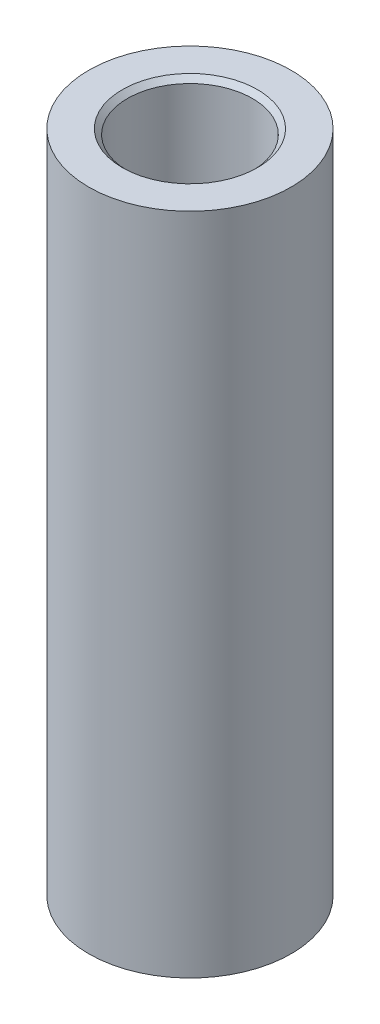
ISO-10303-21;
HEADER;
FILE_DESCRIPTION(('STEP AP214'),'2;1');
FILE_NAME('part.step','',(''),(''),'','','');
FILE_SCHEMA(('AUTOMOTIVE_DESIGN { 1 0 10303 214 1 1 1 1 }'));
ENDSEC;
DATA;
#1=APPLICATION_CONTEXT('core data for automotive mechanical design processes');
#2=APPLICATION_PROTOCOL_DEFINITION('international standard','automotive_design',2000,#1);
#3=PRODUCT_CONTEXT('',#1,'mechanical');
#4=PRODUCT('Part','Part','',(#3));
#5=PRODUCT_RELATED_PRODUCT_CATEGORY('part','',(#4));
#6=PRODUCT_DEFINITION_FORMATION('','',#4);
#7=PRODUCT_DEFINITION_CONTEXT('part definition',#1,'design');
#8=PRODUCT_DEFINITION('design','',#6,#7);
#9=PRODUCT_DEFINITION_SHAPE('','',#8);
#10=(LENGTH_UNIT() NAMED_UNIT(*) SI_UNIT(.MILLI.,.METRE.));
#11=(NAMED_UNIT(*) PLANE_ANGLE_UNIT() SI_UNIT($,.RADIAN.));
#12=(NAMED_UNIT(*) SI_UNIT($,.STERADIAN.) SOLID_ANGLE_UNIT());
#13=UNCERTAINTY_MEASURE_WITH_UNIT(LENGTH_MEASURE(1.E-05),#10,'distance_accuracy_value','');
#14=(GEOMETRIC_REPRESENTATION_CONTEXT(3) GLOBAL_UNCERTAINTY_ASSIGNED_CONTEXT((#13)) GLOBAL_UNIT_ASSIGNED_CONTEXT((#10,
#11,#12)) REPRESENTATION_CONTEXT('',''));
#15=CARTESIAN_POINT('',(0.,0.,0.));
#16=DIRECTION('',(0.,0.,1.));
#17=DIRECTION('',(1.,0.,0.));
#18=AXIS2_PLACEMENT_3D('',#15,#16,#17);
#19=CARTESIAN_POINT('',(0.,52.07,0.));
#20=DIRECTION('',(0.,-1.,0.));
#21=DIRECTION('',(0.,0.,-1.));
#22=AXIS2_PLACEMENT_3D('',#19,#20,#21);
#23=CYLINDRICAL_SURFACE('',#22,7.9375);
#24=CARTESIAN_POINT('',(0.,52.07,0.));
#25=DIRECTION('',(0.,1.,0.));
#26=DIRECTION('',(0.,0.,1.));
#27=AXIS2_PLACEMENT_3D('',#24,#25,#26);
#28=CIRCLE('',#27,7.9375);
#29=CARTESIAN_POINT('',(0.,52.07,7.9375));
#30=VERTEX_POINT('',#29);
#31=EDGE_CURVE('E51',#30,#30,#28,.T.);
#32=ORIENTED_EDGE('',*,*,#31,.F.);
#33=EDGE_LOOP('',(#32));
#34=FACE_BOUND('',#33,.T.);
#35=CARTESIAN_POINT('',(0.,0.,0.));
#36=DIRECTION('',(0.,1.,0.));
#37=DIRECTION('',(0.,0.,1.));
#38=AXIS2_PLACEMENT_3D('',#35,#36,#37);
#39=CIRCLE('',#38,7.9375);
#40=CARTESIAN_POINT('',(0.,0.,7.9375));
#41=VERTEX_POINT('',#40);
#42=EDGE_CURVE('E52',#41,#41,#39,.T.);
#43=ORIENTED_EDGE('',*,*,#42,.T.);
#44=EDGE_LOOP('',(#43));
#45=FACE_BOUND('',#44,.T.);
#46=ADVANCED_FACE('F31',(#34,#45),#23,.T.);
#47=CARTESIAN_POINT('',(0.,52.07,0.));
#48=DIRECTION('',(0.,1.,0.));
#49=DIRECTION('',(0.,0.,1.));
#50=AXIS2_PLACEMENT_3D('',#47,#48,#49);
#51=PLANE('',#50);
#52=CARTESIAN_POINT('',(0.,52.07,0.));
#53=DIRECTION('',(0.,1.,0.));
#54=DIRECTION('',(0.,0.,1.));
#55=AXIS2_PLACEMENT_3D('',#52,#53,#54);
#56=CIRCLE('',#55,5.30219999999999);
#57=CARTESIAN_POINT('',(0.,52.07,5.30219999999999));
#58=VERTEX_POINT('',#57);
#59=EDGE_CURVE('E10',#58,#58,#56,.F.);
#60=ORIENTED_EDGE('',*,*,#59,.T.);
#61=EDGE_LOOP('',(#60));
#62=FACE_BOUND('',#61,.T.);
#63=ORIENTED_EDGE('',*,*,#31,.T.);
#64=EDGE_LOOP('',(#63));
#65=FACE_BOUND('',#64,.T.);
#66=ADVANCED_FACE('F58',(#62,#65),#51,.T.);
#67=CARTESIAN_POINT('',(0.,0.,0.));
#68=DIRECTION('',(0.,1.,0.));
#69=DIRECTION('',(0.,0.,1.));
#70=AXIS2_PLACEMENT_3D('',#67,#68,#69);
#71=PLANE('',#70);
#72=CARTESIAN_POINT('',(0.,0.,0.));
#73=DIRECTION('',(0.,1.,0.));
#74=DIRECTION('',(0.,0.,1.));
#75=AXIS2_PLACEMENT_3D('',#72,#73,#74);
#76=CIRCLE('',#75,5.30219999999999);
#77=CARTESIAN_POINT('',(0.,0.,5.30219999999999));
#78=VERTEX_POINT('',#77);
#79=EDGE_CURVE('E46',#78,#78,#76,.T.);
#80=ORIENTED_EDGE('',*,*,#79,.T.);
#81=EDGE_LOOP('',(#80));
#82=FACE_BOUND('',#81,.T.);
#83=ORIENTED_EDGE('',*,*,#42,.F.);
#84=EDGE_LOOP('',(#83));
#85=FACE_BOUND('',#84,.T.);
#86=ADVANCED_FACE('F65',(#82,#85),#71,.F.);
#87=CARTESIAN_POINT('',(0.,52.07,0.));
#88=DIRECTION('',(0.,1.,0.));
#89=DIRECTION('',(0.,0.,1.));
#90=AXIS2_PLACEMENT_3D('',#87,#88,#89);
#91=CYLINDRICAL_SURFACE('',#90,4.90219999999999);
#92=CARTESIAN_POINT('',(0.,0.400000000000005,0.));
#93=DIRECTION('',(0.,1.,0.));
#94=DIRECTION('',(0.,0.,1.));
#95=AXIS2_PLACEMENT_3D('',#92,#93,#94);
#96=CIRCLE('',#95,4.90219999999999);
#97=CARTESIAN_POINT('',(0.,0.400000000000005,4.90219999999999));
#98=VERTEX_POINT('',#97);
#99=EDGE_CURVE('E38',#98,#98,#96,.F.);
#100=ORIENTED_EDGE('',*,*,#99,.T.);
#101=EDGE_LOOP('',(#100));
#102=FACE_BOUND('',#101,.T.);
#103=CARTESIAN_POINT('',(0.,51.67,0.));
#104=DIRECTION('',(0.,1.,0.));
#105=DIRECTION('',(0.,0.,1.));
#106=AXIS2_PLACEMENT_3D('',#103,#104,#105);
#107=CIRCLE('',#106,4.90219999999999);
#108=CARTESIAN_POINT('',(0.,51.67,4.90219999999999));
#109=VERTEX_POINT('',#108);
#110=EDGE_CURVE('E42',#109,#109,#107,.T.);
#111=ORIENTED_EDGE('',*,*,#110,.T.);
#112=EDGE_LOOP('',(#111));
#113=FACE_BOUND('',#112,.T.);
#114=ADVANCED_FACE('F67',(#102,#113),#91,.F.);
#115=CARTESIAN_POINT('',(0.,0.,0.));
#116=DIRECTION('',(0.,-1.,0.));
#117=DIRECTION('',(0.,0.,-1.));
#118=AXIS2_PLACEMENT_3D('',#115,#116,#117);
#119=CONICAL_SURFACE('',#118,5.30219999999999,0.785398163397448);
#120=ORIENTED_EDGE('',*,*,#99,.F.);
#121=EDGE_LOOP('',(#120));
#122=FACE_BOUND('',#121,.T.);
#123=ORIENTED_EDGE('',*,*,#79,.F.);
#124=EDGE_LOOP('',(#123));
#125=FACE_BOUND('',#124,.T.);
#126=ADVANCED_FACE('F74',(#122,#125),#119,.F.);
#127=CARTESIAN_POINT('',(0.,51.67,0.));
#128=DIRECTION('',(0.,1.,0.));
#129=DIRECTION('',(0.,0.,1.));
#130=AXIS2_PLACEMENT_3D('',#127,#128,#129);
#131=CONICAL_SURFACE('',#130,4.90219999999999,0.785398163397448);
#132=ORIENTED_EDGE('',*,*,#59,.F.);
#133=EDGE_LOOP('',(#132));
#134=FACE_BOUND('',#133,.T.);
#135=ORIENTED_EDGE('',*,*,#110,.F.);
#136=EDGE_LOOP('',(#135));
#137=FACE_BOUND('',#136,.T.);
#138=ADVANCED_FACE('F33',(#134,#137),#131,.F.);
#139=CLOSED_SHELL('',(#46,#66,#86,#114,#126,#138));
#140=MANIFOLD_SOLID_BREP('B2',#139);
#141=ADVANCED_BREP_SHAPE_REPRESENTATION('',(#18,#140),#14);
#142=SHAPE_DEFINITION_REPRESENTATION(#9,#141);
ENDSEC;
END-ISO-10303-21;
